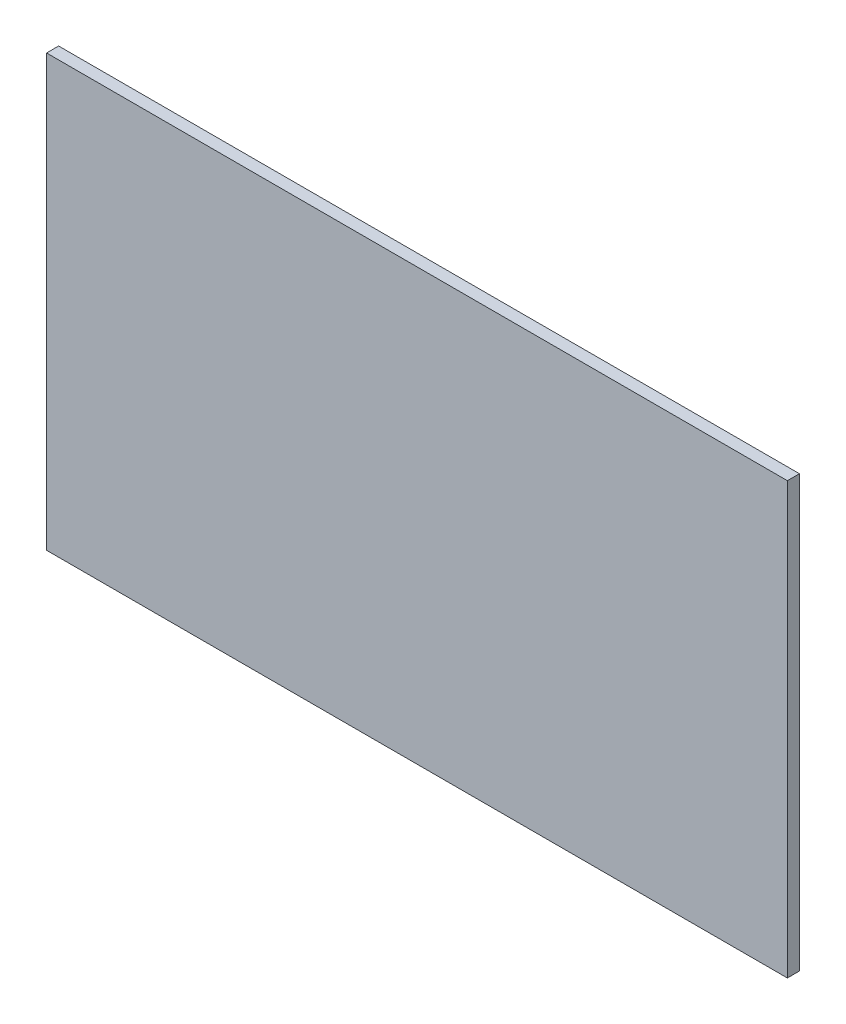
ISO-10303-21;
HEADER;
FILE_DESCRIPTION(('STEP AP214'),'2;1');
FILE_NAME('part.step','',(''),(''),'','','');
FILE_SCHEMA(('AUTOMOTIVE_DESIGN { 1 0 10303 214 1 1 1 1 }'));
ENDSEC;
DATA;
#1=APPLICATION_CONTEXT('core data for automotive mechanical design processes');
#2=APPLICATION_PROTOCOL_DEFINITION('international standard','automotive_design',2000,#1);
#3=PRODUCT_CONTEXT('',#1,'mechanical');
#4=PRODUCT('Part','Part','',(#3));
#5=PRODUCT_RELATED_PRODUCT_CATEGORY('part','',(#4));
#6=PRODUCT_DEFINITION_FORMATION('','',#4);
#7=PRODUCT_DEFINITION_CONTEXT('part definition',#1,'design');
#8=PRODUCT_DEFINITION('design','',#6,#7);
#9=PRODUCT_DEFINITION_SHAPE('','',#8);
#10=(LENGTH_UNIT() NAMED_UNIT(*) SI_UNIT(.MILLI.,.METRE.));
#11=(NAMED_UNIT(*) PLANE_ANGLE_UNIT() SI_UNIT($,.RADIAN.));
#12=(NAMED_UNIT(*) SI_UNIT($,.STERADIAN.) SOLID_ANGLE_UNIT());
#13=UNCERTAINTY_MEASURE_WITH_UNIT(LENGTH_MEASURE(1.E-05),#10,'distance_accuracy_value','');
#14=(GEOMETRIC_REPRESENTATION_CONTEXT(3) GLOBAL_UNCERTAINTY_ASSIGNED_CONTEXT((#13)) GLOBAL_UNIT_ASSIGNED_CONTEXT((#10,
#11,#12)) REPRESENTATION_CONTEXT('',''));
#15=CARTESIAN_POINT('',(0.,0.,0.));
#16=DIRECTION('',(0.,0.,1.));
#17=DIRECTION('',(1.,0.,0.));
#18=AXIS2_PLACEMENT_3D('',#15,#16,#17);
#19=CARTESIAN_POINT('',(-105.471708888458,81.5470588235294,4.2));
#20=DIRECTION('',(1.,0.,0.));
#21=DIRECTION('',(0.,1.,0.));
#22=AXIS2_PLACEMENT_3D('',#19,#20,#21);
#23=PLANE('',#22);
#24=DIRECTION('',(0.,-1.,0.));
#25=VECTOR('',#24,1.);
#26=CARTESIAN_POINT('',(-105.471708888458,81.5470588235294,0.));
#27=LINE('',#26,#25);
#28=CARTESIAN_POINT('',(-105.471708888458,81.5470588235294,0.));
#29=VERTEX_POINT('',#28);
#30=CARTESIAN_POINT('',(-105.471708888458,-68.4529411764705,0.));
#31=VERTEX_POINT('',#30);
#32=EDGE_CURVE('E107',#29,#31,#27,.T.);
#33=ORIENTED_EDGE('',*,*,#32,.T.);
#34=DIRECTION('',(0.,0.,-1.));
#35=VECTOR('',#34,1.);
#36=CARTESIAN_POINT('',(-105.471708888458,-68.4529411764705,4.2));
#37=LINE('',#36,#35);
#38=CARTESIAN_POINT('',(-105.471708888458,-68.4529411764705,4.2));
#39=VERTEX_POINT('',#38);
#40=EDGE_CURVE('E11',#39,#31,#37,.T.);
#41=ORIENTED_EDGE('',*,*,#40,.F.);
#42=DIRECTION('',(0.,-1.,0.));
#43=VECTOR('',#42,1.);
#44=CARTESIAN_POINT('',(-105.471708888458,81.5470588235294,4.2));
#45=LINE('',#44,#43);
#46=CARTESIAN_POINT('',(-105.471708888458,81.5470588235294,4.2));
#47=VERTEX_POINT('',#46);
#48=EDGE_CURVE('E91',#47,#39,#45,.T.);
#49=ORIENTED_EDGE('',*,*,#48,.F.);
#50=DIRECTION('',(0.,0.,-1.));
#51=VECTOR('',#50,1.);
#52=CARTESIAN_POINT('',(-105.471708888458,81.5470588235294,4.2));
#53=LINE('',#52,#51);
#54=EDGE_CURVE('E103',#47,#29,#53,.T.);
#55=ORIENTED_EDGE('',*,*,#54,.T.);
#56=EDGE_LOOP('',(#33,#41,#49,#55));
#57=FACE_BOUND('',#56,.T.);
#58=ADVANCED_FACE('F39',(#57),#23,.F.);
#59=CARTESIAN_POINT('',(-105.471708888458,-68.4529411764705,4.2));
#60=DIRECTION('',(0.,1.,0.));
#61=DIRECTION('',(0.,0.,1.));
#62=AXIS2_PLACEMENT_3D('',#59,#60,#61);
#63=PLANE('',#62);
#64=DIRECTION('',(1.,0.,0.));
#65=VECTOR('',#64,1.);
#66=CARTESIAN_POINT('',(-105.471708888458,-68.4529411764705,0.));
#67=LINE('',#66,#65);
#68=CARTESIAN_POINT('',(152.528291111542,-68.4529411764705,0.));
#69=VERTEX_POINT('',#68);
#70=EDGE_CURVE('E96',#31,#69,#67,.T.);
#71=ORIENTED_EDGE('',*,*,#70,.T.);
#72=DIRECTION('',(0.,0.,-1.));
#73=VECTOR('',#72,1.);
#74=CARTESIAN_POINT('',(152.528291111542,-68.4529411764705,4.2));
#75=LINE('',#74,#73);
#76=CARTESIAN_POINT('',(152.528291111542,-68.4529411764705,4.2));
#77=VERTEX_POINT('',#76);
#78=EDGE_CURVE('E48',#77,#69,#75,.T.);
#79=ORIENTED_EDGE('',*,*,#78,.F.);
#80=DIRECTION('',(1.,0.,0.));
#81=VECTOR('',#80,1.);
#82=CARTESIAN_POINT('',(-105.471708888458,-68.4529411764705,4.2));
#83=LINE('',#82,#81);
#84=EDGE_CURVE('E86',#39,#77,#83,.T.);
#85=ORIENTED_EDGE('',*,*,#84,.F.);
#86=ORIENTED_EDGE('',*,*,#40,.T.);
#87=EDGE_LOOP('',(#71,#79,#85,#86));
#88=FACE_BOUND('',#87,.T.);
#89=ADVANCED_FACE('F95',(#88),#63,.F.);
#90=CARTESIAN_POINT('',(152.528291111542,81.5470588235294,4.2));
#91=DIRECTION('',(-1.,0.,0.));
#92=DIRECTION('',(0.,0.,1.));
#93=AXIS2_PLACEMENT_3D('',#90,#91,#92);
#94=PLANE('',#93);
#95=DIRECTION('',(0.,1.,0.));
#96=VECTOR('',#95,1.);
#97=CARTESIAN_POINT('',(152.528291111542,81.5470588235294,0.));
#98=LINE('',#97,#96);
#99=CARTESIAN_POINT('',(152.528291111542,81.5470588235294,0.));
#100=VERTEX_POINT('',#99);
#101=EDGE_CURVE('E73',#69,#100,#98,.T.);
#102=ORIENTED_EDGE('',*,*,#101,.T.);
#103=DIRECTION('',(0.,0.,-1.));
#104=VECTOR('',#103,1.);
#105=CARTESIAN_POINT('',(152.528291111542,81.5470588235294,4.2));
#106=LINE('',#105,#104);
#107=CARTESIAN_POINT('',(152.528291111542,81.5470588235294,4.2));
#108=VERTEX_POINT('',#107);
#109=EDGE_CURVE('E98',#108,#100,#106,.T.);
#110=ORIENTED_EDGE('',*,*,#109,.F.);
#111=DIRECTION('',(0.,1.,0.));
#112=VECTOR('',#111,1.);
#113=CARTESIAN_POINT('',(152.528291111542,81.5470588235294,4.2));
#114=LINE('',#113,#112);
#115=EDGE_CURVE('E89',#77,#108,#114,.T.);
#116=ORIENTED_EDGE('',*,*,#115,.F.);
#117=ORIENTED_EDGE('',*,*,#78,.T.);
#118=EDGE_LOOP('',(#102,#110,#116,#117));
#119=FACE_BOUND('',#118,.T.);
#120=ADVANCED_FACE('F99',(#119),#94,.F.);
#121=CARTESIAN_POINT('',(-105.471708888458,81.5470588235294,4.2));
#122=DIRECTION('',(0.,-1.,0.));
#123=DIRECTION('',(0.,0.,-1.));
#124=AXIS2_PLACEMENT_3D('',#121,#122,#123);
#125=PLANE('',#124);
#126=DIRECTION('',(-1.,0.,0.));
#127=VECTOR('',#126,1.);
#128=CARTESIAN_POINT('',(-105.471708888458,81.5470588235294,0.));
#129=LINE('',#128,#127);
#130=EDGE_CURVE('E79',#100,#29,#129,.T.);
#131=ORIENTED_EDGE('',*,*,#130,.T.);
#132=ORIENTED_EDGE('',*,*,#54,.F.);
#133=DIRECTION('',(-1.,0.,0.));
#134=VECTOR('',#133,1.);
#135=CARTESIAN_POINT('',(-105.471708888458,81.5470588235294,4.2));
#136=LINE('',#135,#134);
#137=EDGE_CURVE('E56',#108,#47,#136,.T.);
#138=ORIENTED_EDGE('',*,*,#137,.F.);
#139=ORIENTED_EDGE('',*,*,#109,.T.);
#140=EDGE_LOOP('',(#131,#132,#138,#139));
#141=FACE_BOUND('',#140,.T.);
#142=ADVANCED_FACE('F120',(#141),#125,.F.);
#143=CARTESIAN_POINT('',(0.,0.,4.2));
#144=DIRECTION('',(0.,0.,1.));
#145=DIRECTION('',(1.,0.,0.));
#146=AXIS2_PLACEMENT_3D('',#143,#144,#145);
#147=PLANE('',#146);
#148=ORIENTED_EDGE('',*,*,#48,.T.);
#149=ORIENTED_EDGE('',*,*,#84,.T.);
#150=ORIENTED_EDGE('',*,*,#115,.T.);
#151=ORIENTED_EDGE('',*,*,#137,.T.);
#152=EDGE_LOOP('',(#148,#149,#150,#151));
#153=FACE_BOUND('',#152,.T.);
#154=ADVANCED_FACE('F87',(#153),#147,.T.);
#155=CARTESIAN_POINT('',(0.,0.,0.));
#156=DIRECTION('',(0.,0.,1.));
#157=DIRECTION('',(1.,0.,0.));
#158=AXIS2_PLACEMENT_3D('',#155,#156,#157);
#159=PLANE('',#158);
#160=ORIENTED_EDGE('',*,*,#32,.F.);
#161=ORIENTED_EDGE('',*,*,#130,.F.);
#162=ORIENTED_EDGE('',*,*,#101,.F.);
#163=ORIENTED_EDGE('',*,*,#70,.F.);
#164=EDGE_LOOP('',(#160,#161,#162,#163));
#165=FACE_BOUND('',#164,.T.);
#166=ADVANCED_FACE('F123',(#165),#159,.F.);
#167=CLOSED_SHELL('',(#58,#89,#120,#142,#154,#166));
#168=MANIFOLD_SOLID_BREP('B2',#167);
#169=ADVANCED_BREP_SHAPE_REPRESENTATION('',(#18,#168),#14);
#170=SHAPE_DEFINITION_REPRESENTATION(#9,#169);
ENDSEC;
END-ISO-10303-21;
